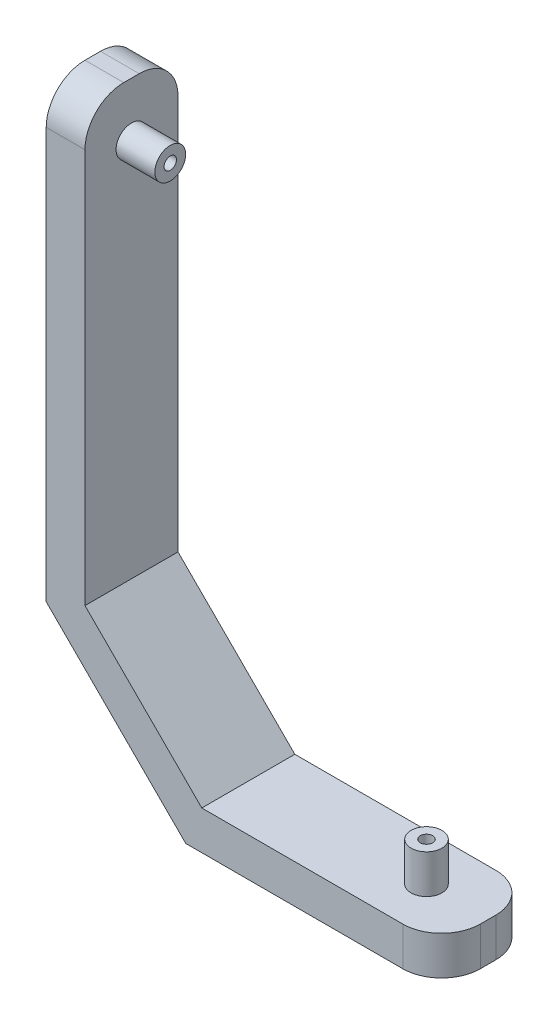
ISO-10303-21;
HEADER;
FILE_DESCRIPTION(('STEP AP214'),'2;1');
FILE_NAME('part.step','',(''),(''),'','','');
FILE_SCHEMA(('AUTOMOTIVE_DESIGN { 1 0 10303 214 1 1 1 1 }'));
ENDSEC;
DATA;
#1=APPLICATION_CONTEXT('core data for automotive mechanical design processes');
#2=APPLICATION_PROTOCOL_DEFINITION('international standard','automotive_design',2000,#1);
#3=PRODUCT_CONTEXT('',#1,'mechanical');
#4=PRODUCT('Part','Part','',(#3));
#5=PRODUCT_RELATED_PRODUCT_CATEGORY('part','',(#4));
#6=PRODUCT_DEFINITION_FORMATION('','',#4);
#7=PRODUCT_DEFINITION_CONTEXT('part definition',#1,'design');
#8=PRODUCT_DEFINITION('design','',#6,#7);
#9=PRODUCT_DEFINITION_SHAPE('','',#8);
#10=(LENGTH_UNIT() NAMED_UNIT(*) SI_UNIT(.MILLI.,.METRE.));
#11=(NAMED_UNIT(*) PLANE_ANGLE_UNIT() SI_UNIT($,.RADIAN.));
#12=(NAMED_UNIT(*) SI_UNIT($,.STERADIAN.) SOLID_ANGLE_UNIT());
#13=UNCERTAINTY_MEASURE_WITH_UNIT(LENGTH_MEASURE(1.E-05),#10,'distance_accuracy_value','');
#14=(GEOMETRIC_REPRESENTATION_CONTEXT(3) GLOBAL_UNCERTAINTY_ASSIGNED_CONTEXT((#13)) GLOBAL_UNIT_ASSIGNED_CONTEXT((#10,
#11,#12)) REPRESENTATION_CONTEXT('',''));
#15=CARTESIAN_POINT('',(0.,0.,0.));
#16=DIRECTION('',(0.,0.,1.));
#17=DIRECTION('',(1.,0.,0.));
#18=AXIS2_PLACEMENT_3D('',#15,#16,#17);
#19=CARTESIAN_POINT('',(-86.2,128.,0.));
#20=DIRECTION('',(1.,0.,0.));
#21=DIRECTION('',(0.,0.,-1.));
#22=AXIS2_PLACEMENT_3D('',#19,#20,#21);
#23=CYLINDRICAL_SURFACE('',#22,1.6);
#24=CARTESIAN_POINT('',(-66.2,128.,0.));
#25=DIRECTION('',(1.,0.,0.));
#26=DIRECTION('',(0.,0.,-1.));
#27=AXIS2_PLACEMENT_3D('',#24,#25,#26);
#28=CIRCLE('',#27,1.6);
#29=CARTESIAN_POINT('',(-66.2,128.,-1.6));
#30=VERTEX_POINT('',#29);
#31=EDGE_CURVE('E315',#30,#30,#28,.T.);
#32=ORIENTED_EDGE('',*,*,#31,.T.);
#33=EDGE_LOOP('',(#32));
#34=FACE_BOUND('',#33,.T.);
#35=CARTESIAN_POINT('',(-83.2,128.,0.));
#36=DIRECTION('',(-1.,0.,0.));
#37=DIRECTION('',(0.,0.,1.));
#38=AXIS2_PLACEMENT_3D('',#35,#36,#37);
#39=CIRCLE('',#38,1.6);
#40=CARTESIAN_POINT('',(-83.2,128.,1.6));
#41=VERTEX_POINT('',#40);
#42=EDGE_CURVE('E112',#41,#41,#39,.F.);
#43=ORIENTED_EDGE('',*,*,#42,.F.);
#44=EDGE_LOOP('',(#43));
#45=FACE_BOUND('',#44,.T.);
#46=ADVANCED_FACE('F108',(#34,#45),#23,.F.);
#47=CARTESIAN_POINT('',(0.,0.,-12.));
#48=DIRECTION('',(0.,0.,1.));
#49=DIRECTION('',(1.,0.,0.));
#50=AXIS2_PLACEMENT_3D('',#47,#48,#49);
#51=PLANE('',#50);
#52=DIRECTION('',(0.,-1.,0.));
#53=VECTOR('',#52,1.);
#54=CARTESIAN_POINT('',(-86.2,0.,-12.));
#55=LINE('',#54,#53);
#56=CARTESIAN_POINT('',(-86.2,132.,-12.));
#57=VERTEX_POINT('',#56);
#58=CARTESIAN_POINT('',(-86.2,26.0000000000001,-12.));
#59=VERTEX_POINT('',#58);
#60=EDGE_CURVE('E237',#57,#59,#55,.T.);
#61=ORIENTED_EDGE('',*,*,#60,.F.);
#62=DIRECTION('',(-1.,0.,0.));
#63=VECTOR('',#62,1.);
#64=CARTESIAN_POINT('',(0.,132.,-12.));
#65=LINE('',#64,#63);
#66=CARTESIAN_POINT('',(-76.2,132.,-12.));
#67=VERTEX_POINT('',#66);
#68=EDGE_CURVE('E269',#57,#67,#65,.F.);
#69=ORIENTED_EDGE('',*,*,#68,.T.);
#70=DIRECTION('',(0.,-1.,0.));
#71=VECTOR('',#70,1.);
#72=CARTESIAN_POINT('',(-76.2,0.,-12.));
#73=LINE('',#72,#71);
#74=CARTESIAN_POINT('',(-76.2,30.142135623731,-12.));
#75=VERTEX_POINT('',#74);
#76=EDGE_CURVE('E230',#67,#75,#73,.T.);
#77=ORIENTED_EDGE('',*,*,#76,.T.);
#78=DIRECTION('',(0.707106781186547,-0.707106781186548,0.));
#79=VECTOR('',#78,1.);
#80=CARTESIAN_POINT('',(-23.0289321881346,-23.0289321881345,-12.));
#81=LINE('',#80,#79);
#82=CARTESIAN_POINT('',(-46.057864376269,0.,-12.));
#83=VERTEX_POINT('',#82);
#84=EDGE_CURVE('E226',#75,#83,#81,.T.);
#85=ORIENTED_EDGE('',*,*,#84,.T.);
#86=DIRECTION('',(-1.,0.,0.));
#87=VECTOR('',#86,1.);
#88=CARTESIAN_POINT('',(15.8,0.,-12.));
#89=LINE('',#88,#87);
#90=CARTESIAN_POINT('',(5.8,0.,-12.));
#91=VERTEX_POINT('',#90);
#92=EDGE_CURVE('E209',#91,#83,#89,.T.);
#93=ORIENTED_EDGE('',*,*,#92,.F.);
#94=DIRECTION('',(0.,-1.,0.));
#95=VECTOR('',#94,1.);
#96=CARTESIAN_POINT('',(5.8,0.,-12.));
#97=LINE('',#96,#95);
#98=CARTESIAN_POINT('',(5.8,-10.,-12.));
#99=VERTEX_POINT('',#98);
#100=EDGE_CURVE('E207',#91,#99,#97,.T.);
#101=ORIENTED_EDGE('',*,*,#100,.T.);
#102=DIRECTION('',(-1.,0.,0.));
#103=VECTOR('',#102,1.);
#104=CARTESIAN_POINT('',(15.8,-10.,-12.));
#105=LINE('',#104,#103);
#106=CARTESIAN_POINT('',(-50.2,-10.,-12.));
#107=VERTEX_POINT('',#106);
#108=EDGE_CURVE('E199',#99,#107,#105,.T.);
#109=ORIENTED_EDGE('',*,*,#108,.T.);
#110=DIRECTION('',(-0.707106781186546,0.707106781186549,0.));
#111=VECTOR('',#110,1.);
#112=CARTESIAN_POINT('',(-30.1000000000001,-30.1,-12.));
#113=LINE('',#112,#111);
#114=EDGE_CURVE('E204',#107,#59,#113,.T.);
#115=ORIENTED_EDGE('',*,*,#114,.T.);
#116=EDGE_LOOP('',(#61,#69,#77,#85,#93,#101,#109,#115));
#117=FACE_BOUND('',#116,.T.);
#118=ADVANCED_FACE('F202',(#117),#51,.F.);
#119=CARTESIAN_POINT('',(15.8,0.,-12.));
#120=DIRECTION('',(0.,1.,0.));
#121=DIRECTION('',(-1.,0.,0.));
#122=AXIS2_PLACEMENT_3D('',#119,#120,#121);
#123=PLANE('',#122);
#124=CARTESIAN_POINT('',(-0.0882280599999965,0.,0.));
#125=DIRECTION('',(0.,1.,0.));
#126=DIRECTION('',(0.,0.,1.));
#127=AXIS2_PLACEMENT_3D('',#124,#125,#126);
#128=CIRCLE('',#127,3.98);
#129=CARTESIAN_POINT('',(-0.0882280599999965,0.,3.98));
#130=VERTEX_POINT('',#129);
#131=EDGE_CURVE('E327',#130,#130,#128,.T.);
#132=ORIENTED_EDGE('',*,*,#131,.F.);
#133=EDGE_LOOP('',(#132));
#134=FACE_BOUND('',#133,.T.);
#135=DIRECTION('',(0.,0.,1.));
#136=VECTOR('',#135,1.);
#137=CARTESIAN_POINT('',(15.8,0.,-12.));
#138=LINE('',#137,#136);
#139=CARTESIAN_POINT('',(15.8,0.,-2.));
#140=VERTEX_POINT('',#139);
#141=CARTESIAN_POINT('',(15.8,0.,2.));
#142=VERTEX_POINT('',#141);
#143=EDGE_CURVE('E227',#140,#142,#138,.T.);
#144=ORIENTED_EDGE('',*,*,#143,.F.);
#145=CARTESIAN_POINT('',(5.8,0.,-2.));
#146=DIRECTION('',(0.,1.,0.));
#147=DIRECTION('',(-1.,0.,0.));
#148=AXIS2_PLACEMENT_3D('',#145,#146,#147);
#149=CIRCLE('',#148,10.);
#150=EDGE_CURVE('E285',#140,#91,#149,.T.);
#151=ORIENTED_EDGE('',*,*,#150,.T.);
#152=ORIENTED_EDGE('',*,*,#92,.T.);
#153=DIRECTION('',(0.,0.,-1.));
#154=VECTOR('',#153,1.);
#155=CARTESIAN_POINT('',(-46.057864376269,0.,12.));
#156=LINE('',#155,#154);
#157=CARTESIAN_POINT('',(-46.057864376269,0.,12.));
#158=VERTEX_POINT('',#157);
#159=EDGE_CURVE('E220',#158,#83,#156,.T.);
#160=ORIENTED_EDGE('',*,*,#159,.F.);
#161=DIRECTION('',(-1.,0.,0.));
#162=VECTOR('',#161,1.);
#163=CARTESIAN_POINT('',(15.8,0.,12.));
#164=LINE('',#163,#162);
#165=CARTESIAN_POINT('',(5.8,0.,12.));
#166=VERTEX_POINT('',#165);
#167=EDGE_CURVE('E210',#166,#158,#164,.T.);
#168=ORIENTED_EDGE('',*,*,#167,.F.);
#169=CARTESIAN_POINT('',(5.8,0.,2.));
#170=DIRECTION('',(0.,1.,0.));
#171=DIRECTION('',(-1.,0.,0.));
#172=AXIS2_PLACEMENT_3D('',#169,#170,#171);
#173=CIRCLE('',#172,10.);
#174=EDGE_CURVE('E129',#166,#142,#173,.T.);
#175=ORIENTED_EDGE('',*,*,#174,.T.);
#176=EDGE_LOOP('',(#144,#151,#152,#160,#168,#175));
#177=FACE_BOUND('',#176,.T.);
#178=ADVANCED_FACE('F364',(#134,#177),#123,.T.);
#179=CARTESIAN_POINT('',(15.8,0.,-12.));
#180=DIRECTION('',(-1.,0.,0.));
#181=DIRECTION('',(0.,0.,1.));
#182=AXIS2_PLACEMENT_3D('',#179,#180,#181);
#183=PLANE('',#182);
#184=DIRECTION('',(0.,0.,1.));
#185=VECTOR('',#184,1.);
#186=CARTESIAN_POINT('',(15.8,-10.,-12.));
#187=LINE('',#186,#185);
#188=CARTESIAN_POINT('',(15.8,-10.,-2.));
#189=VERTEX_POINT('',#188);
#190=CARTESIAN_POINT('',(15.8,-10.,2.));
#191=VERTEX_POINT('',#190);
#192=EDGE_CURVE('E232',#189,#191,#187,.T.);
#193=ORIENTED_EDGE('',*,*,#192,.F.);
#194=DIRECTION('',(0.,-1.,0.));
#195=VECTOR('',#194,1.);
#196=CARTESIAN_POINT('',(15.8,0.,-2.));
#197=LINE('',#196,#195);
#198=EDGE_CURVE('E282',#189,#140,#197,.F.);
#199=ORIENTED_EDGE('',*,*,#198,.T.);
#200=ORIENTED_EDGE('',*,*,#143,.T.);
#201=DIRECTION('',(0.,-1.,0.));
#202=VECTOR('',#201,1.);
#203=CARTESIAN_POINT('',(15.8,-10.,2.));
#204=LINE('',#203,#202);
#205=EDGE_CURVE('E279',#142,#191,#204,.T.);
#206=ORIENTED_EDGE('',*,*,#205,.T.);
#207=EDGE_LOOP('',(#193,#199,#200,#206));
#208=FACE_BOUND('',#207,.T.);
#209=ADVANCED_FACE('F306',(#208),#183,.F.);
#210=CARTESIAN_POINT('',(15.8,-10.,-12.));
#211=DIRECTION('',(0.,1.,0.));
#212=DIRECTION('',(-1.,0.,0.));
#213=AXIS2_PLACEMENT_3D('',#210,#211,#212);
#214=PLANE('',#213);
#215=CARTESIAN_POINT('',(-0.0882280599999965,-10.,0.));
#216=DIRECTION('',(0.,-1.,0.));
#217=DIRECTION('',(0.,0.,-1.));
#218=AXIS2_PLACEMENT_3D('',#215,#216,#217);
#219=CIRCLE('',#218,4.);
#220=CARTESIAN_POINT('',(-0.0882280599999965,-10.,-4.));
#221=VERTEX_POINT('',#220);
#222=EDGE_CURVE('E339',#221,#221,#219,.T.);
#223=ORIENTED_EDGE('',*,*,#222,.F.);
#224=EDGE_LOOP('',(#223));
#225=FACE_BOUND('',#224,.T.);
#226=ORIENTED_EDGE('',*,*,#108,.F.);
#227=CARTESIAN_POINT('',(5.8,-10.,-2.));
#228=DIRECTION('',(0.,1.,0.));
#229=DIRECTION('',(-1.,0.,0.));
#230=AXIS2_PLACEMENT_3D('',#227,#228,#229);
#231=CIRCLE('',#230,10.);
#232=EDGE_CURVE('E277',#99,#189,#231,.F.);
#233=ORIENTED_EDGE('',*,*,#232,.T.);
#234=ORIENTED_EDGE('',*,*,#192,.T.);
#235=CARTESIAN_POINT('',(5.8,-10.,2.));
#236=DIRECTION('',(0.,1.,0.));
#237=DIRECTION('',(-1.,0.,0.));
#238=AXIS2_PLACEMENT_3D('',#235,#236,#237);
#239=CIRCLE('',#238,10.);
#240=CARTESIAN_POINT('',(5.8,-10.,12.));
#241=VERTEX_POINT('',#240);
#242=EDGE_CURVE('E275',#191,#241,#239,.F.);
#243=ORIENTED_EDGE('',*,*,#242,.T.);
#244=DIRECTION('',(-1.,0.,0.));
#245=VECTOR('',#244,1.);
#246=CARTESIAN_POINT('',(15.8,-10.,12.));
#247=LINE('',#246,#245);
#248=CARTESIAN_POINT('',(-50.2,-10.,12.));
#249=VERTEX_POINT('',#248);
#250=EDGE_CURVE('E215',#241,#249,#247,.T.);
#251=ORIENTED_EDGE('',*,*,#250,.T.);
#252=DIRECTION('',(0.,0.,-1.));
#253=VECTOR('',#252,1.);
#254=CARTESIAN_POINT('',(-50.2,-10.,12.));
#255=LINE('',#254,#253);
#256=EDGE_CURVE('E213',#249,#107,#255,.T.);
#257=ORIENTED_EDGE('',*,*,#256,.T.);
#258=EDGE_LOOP('',(#226,#233,#234,#243,#251,#257));
#259=FACE_BOUND('',#258,.T.);
#260=ADVANCED_FACE('F214',(#225,#259),#214,.F.);
#261=CARTESIAN_POINT('',(-30.1000000000001,-30.1,12.));
#262=DIRECTION('',(-0.707106781186548,-0.707106781186546,0.));
#263=DIRECTION('',(0.707106781186546,-0.707106781186549,0.));
#264=AXIS2_PLACEMENT_3D('',#261,#262,#263);
#265=PLANE('',#264);
#266=DIRECTION('',(0.,0.,-1.));
#267=VECTOR('',#266,1.);
#268=CARTESIAN_POINT('',(-86.2,26.0000000000001,12.));
#269=LINE('',#268,#267);
#270=CARTESIAN_POINT('',(-86.2,26.0000000000001,12.));
#271=VERTEX_POINT('',#270);
#272=EDGE_CURVE('E225',#271,#59,#269,.T.);
#273=ORIENTED_EDGE('',*,*,#272,.T.);
#274=ORIENTED_EDGE('',*,*,#114,.F.);
#275=ORIENTED_EDGE('',*,*,#256,.F.);
#276=DIRECTION('',(-0.707106781186546,0.707106781186549,0.));
#277=VECTOR('',#276,1.);
#278=CARTESIAN_POINT('',(-30.1000000000001,-30.1,12.));
#279=LINE('',#278,#277);
#280=EDGE_CURVE('E239',#249,#271,#279,.T.);
#281=ORIENTED_EDGE('',*,*,#280,.T.);
#282=EDGE_LOOP('',(#273,#274,#275,#281));
#283=FACE_BOUND('',#282,.T.);
#284=ADVANCED_FACE('F223',(#283),#265,.T.);
#285=CARTESIAN_POINT('',(-23.0289321881346,-23.0289321881345,12.));
#286=DIRECTION('',(0.707106781186548,0.707106781186547,0.));
#287=DIRECTION('',(-0.707106781186547,0.707106781186548,0.));
#288=AXIS2_PLACEMENT_3D('',#285,#286,#287);
#289=PLANE('',#288);
#290=ORIENTED_EDGE('',*,*,#159,.T.);
#291=ORIENTED_EDGE('',*,*,#84,.F.);
#292=DIRECTION('',(0.,0.,-1.));
#293=VECTOR('',#292,1.);
#294=CARTESIAN_POINT('',(-76.2,30.142135623731,12.));
#295=LINE('',#294,#293);
#296=CARTESIAN_POINT('',(-76.2,30.142135623731,12.));
#297=VERTEX_POINT('',#296);
#298=EDGE_CURVE('E255',#297,#75,#295,.T.);
#299=ORIENTED_EDGE('',*,*,#298,.F.);
#300=DIRECTION('',(0.707106781186547,-0.707106781186548,0.));
#301=VECTOR('',#300,1.);
#302=CARTESIAN_POINT('',(-23.0289321881346,-23.0289321881345,12.));
#303=LINE('',#302,#301);
#304=EDGE_CURVE('E241',#297,#158,#303,.T.);
#305=ORIENTED_EDGE('',*,*,#304,.T.);
#306=EDGE_LOOP('',(#290,#291,#299,#305));
#307=FACE_BOUND('',#306,.T.);
#308=ADVANCED_FACE('F361',(#307),#289,.T.);
#309=CARTESIAN_POINT('',(-76.2,0.,12.));
#310=DIRECTION('',(1.,0.,0.));
#311=DIRECTION('',(0.,1.,0.));
#312=AXIS2_PLACEMENT_3D('',#309,#310,#311);
#313=PLANE('',#312);
#314=CARTESIAN_POINT('',(-76.2,128.,0.));
#315=DIRECTION('',(1.,0.,0.));
#316=DIRECTION('',(0.,0.,-1.));
#317=AXIS2_PLACEMENT_3D('',#314,#315,#316);
#318=CIRCLE('',#317,3.98);
#319=CARTESIAN_POINT('',(-76.2,128.,-3.98));
#320=VERTEX_POINT('',#319);
#321=EDGE_CURVE('E312',#320,#320,#318,.T.);
#322=ORIENTED_EDGE('',*,*,#321,.F.);
#323=EDGE_LOOP('',(#322));
#324=FACE_BOUND('',#323,.T.);
#325=ORIENTED_EDGE('',*,*,#76,.F.);
#326=CARTESIAN_POINT('',(-76.2,132.,-2.));
#327=DIRECTION('',(1.,0.,0.));
#328=DIRECTION('',(0.,1.,0.));
#329=AXIS2_PLACEMENT_3D('',#326,#327,#328);
#330=CIRCLE('',#329,10.);
#331=CARTESIAN_POINT('',(-76.2,142.,-2.));
#332=VERTEX_POINT('',#331);
#333=EDGE_CURVE('E273',#67,#332,#330,.T.);
#334=ORIENTED_EDGE('',*,*,#333,.T.);
#335=DIRECTION('',(0.,0.,-1.));
#336=VECTOR('',#335,1.);
#337=CARTESIAN_POINT('',(-76.2,142.,12.));
#338=LINE('',#337,#336);
#339=CARTESIAN_POINT('',(-76.2,142.,2.));
#340=VERTEX_POINT('',#339);
#341=EDGE_CURVE('E252',#340,#332,#338,.T.);
#342=ORIENTED_EDGE('',*,*,#341,.F.);
#343=CARTESIAN_POINT('',(-76.2,132.,2.));
#344=DIRECTION('',(1.,0.,0.));
#345=DIRECTION('',(0.,1.,0.));
#346=AXIS2_PLACEMENT_3D('',#343,#344,#345);
#347=CIRCLE('',#346,10.);
#348=CARTESIAN_POINT('',(-76.2,132.,12.));
#349=VERTEX_POINT('',#348);
#350=EDGE_CURVE('E271',#340,#349,#347,.T.);
#351=ORIENTED_EDGE('',*,*,#350,.T.);
#352=DIRECTION('',(0.,-1.,0.));
#353=VECTOR('',#352,1.);
#354=CARTESIAN_POINT('',(-76.2,0.,12.));
#355=LINE('',#354,#353);
#356=EDGE_CURVE('E244',#349,#297,#355,.T.);
#357=ORIENTED_EDGE('',*,*,#356,.T.);
#358=ORIENTED_EDGE('',*,*,#298,.T.);
#359=EDGE_LOOP('',(#325,#334,#342,#351,#357,#358));
#360=FACE_BOUND('',#359,.T.);
#361=ADVANCED_FACE('F410',(#324,#360),#313,.T.);
#362=CARTESIAN_POINT('',(0.,142.,12.));
#363=DIRECTION('',(0.,-1.,0.));
#364=DIRECTION('',(0.,0.,-1.));
#365=AXIS2_PLACEMENT_3D('',#362,#363,#364);
#366=PLANE('',#365);
#367=ORIENTED_EDGE('',*,*,#341,.T.);
#368=DIRECTION('',(-1.,0.,0.));
#369=VECTOR('',#368,1.);
#370=CARTESIAN_POINT('',(0.,142.,-2.));
#371=LINE('',#370,#369);
#372=CARTESIAN_POINT('',(-86.2,142.,-2.));
#373=VERTEX_POINT('',#372);
#374=EDGE_CURVE('E261',#332,#373,#371,.T.);
#375=ORIENTED_EDGE('',*,*,#374,.T.);
#376=DIRECTION('',(0.,0.,-1.));
#377=VECTOR('',#376,1.);
#378=CARTESIAN_POINT('',(-86.2,142.,12.));
#379=LINE('',#378,#377);
#380=CARTESIAN_POINT('',(-86.2,142.,2.));
#381=VERTEX_POINT('',#380);
#382=EDGE_CURVE('E249',#381,#373,#379,.T.);
#383=ORIENTED_EDGE('',*,*,#382,.F.);
#384=DIRECTION('',(-1.,0.,0.));
#385=VECTOR('',#384,1.);
#386=CARTESIAN_POINT('',(-76.2,142.,2.));
#387=LINE('',#386,#385);
#388=EDGE_CURVE('E219',#381,#340,#387,.F.);
#389=ORIENTED_EDGE('',*,*,#388,.T.);
#390=EDGE_LOOP('',(#367,#375,#383,#389));
#391=FACE_BOUND('',#390,.T.);
#392=ADVANCED_FACE('F414',(#391),#366,.F.);
#393=CARTESIAN_POINT('',(-86.2,0.,12.));
#394=DIRECTION('',(1.,0.,0.));
#395=DIRECTION('',(0.,1.,0.));
#396=AXIS2_PLACEMENT_3D('',#393,#394,#395);
#397=PLANE('',#396);
#398=CARTESIAN_POINT('',(-86.2,128.,0.));
#399=DIRECTION('',(-1.,0.,0.));
#400=DIRECTION('',(0.,0.,1.));
#401=AXIS2_PLACEMENT_3D('',#398,#399,#400);
#402=CIRCLE('',#401,2.);
#403=CARTESIAN_POINT('',(-86.2,128.,2.));
#404=VERTEX_POINT('',#403);
#405=EDGE_CURVE('E320',#404,#404,#402,.T.);
#406=ORIENTED_EDGE('',*,*,#405,.F.);
#407=EDGE_LOOP('',(#406));
#408=FACE_BOUND('',#407,.T.);
#409=ORIENTED_EDGE('',*,*,#382,.T.);
#410=CARTESIAN_POINT('',(-86.2,132.,-2.));
#411=DIRECTION('',(1.,0.,0.));
#412=DIRECTION('',(0.,1.,0.));
#413=AXIS2_PLACEMENT_3D('',#410,#411,#412);
#414=CIRCLE('',#413,10.);
#415=EDGE_CURVE('E266',#373,#57,#414,.F.);
#416=ORIENTED_EDGE('',*,*,#415,.T.);
#417=ORIENTED_EDGE('',*,*,#60,.T.);
#418=ORIENTED_EDGE('',*,*,#272,.F.);
#419=DIRECTION('',(0.,-1.,0.));
#420=VECTOR('',#419,1.);
#421=CARTESIAN_POINT('',(-86.2,0.,12.));
#422=LINE('',#421,#420);
#423=CARTESIAN_POINT('',(-86.2,132.,12.));
#424=VERTEX_POINT('',#423);
#425=EDGE_CURVE('E246',#424,#271,#422,.T.);
#426=ORIENTED_EDGE('',*,*,#425,.F.);
#427=CARTESIAN_POINT('',(-86.2,132.,2.));
#428=DIRECTION('',(1.,0.,0.));
#429=DIRECTION('',(0.,1.,0.));
#430=AXIS2_PLACEMENT_3D('',#427,#428,#429);
#431=CIRCLE('',#430,10.);
#432=EDGE_CURVE('E264',#424,#381,#431,.F.);
#433=ORIENTED_EDGE('',*,*,#432,.T.);
#434=EDGE_LOOP('',(#409,#416,#417,#418,#426,#433));
#435=FACE_BOUND('',#434,.T.);
#436=ADVANCED_FACE('F296',(#408,#435),#397,.F.);
#437=CARTESIAN_POINT('',(0.,0.,12.));
#438=DIRECTION('',(0.,0.,1.));
#439=DIRECTION('',(1.,0.,0.));
#440=AXIS2_PLACEMENT_3D('',#437,#438,#439);
#441=PLANE('',#440);
#442=ORIENTED_EDGE('',*,*,#250,.F.);
#443=DIRECTION('',(0.,-1.,0.));
#444=VECTOR('',#443,1.);
#445=CARTESIAN_POINT('',(5.8,0.,12.));
#446=LINE('',#445,#444);
#447=EDGE_CURVE('E12',#241,#166,#446,.F.);
#448=ORIENTED_EDGE('',*,*,#447,.T.);
#449=ORIENTED_EDGE('',*,*,#167,.T.);
#450=ORIENTED_EDGE('',*,*,#304,.F.);
#451=ORIENTED_EDGE('',*,*,#356,.F.);
#452=DIRECTION('',(-1.,0.,0.));
#453=VECTOR('',#452,1.);
#454=CARTESIAN_POINT('',(-86.2,132.,12.));
#455=LINE('',#454,#453);
#456=EDGE_CURVE('E117',#349,#424,#455,.T.);
#457=ORIENTED_EDGE('',*,*,#456,.T.);
#458=ORIENTED_EDGE('',*,*,#425,.T.);
#459=ORIENTED_EDGE('',*,*,#280,.F.);
#460=EDGE_LOOP('',(#442,#448,#449,#450,#451,#457,#458,#459));
#461=FACE_BOUND('',#460,.T.);
#462=ADVANCED_FACE('F291',(#461),#441,.T.);
#463=CARTESIAN_POINT('',(0.,132.,-2.));
#464=DIRECTION('',(-1.,0.,0.));
#465=DIRECTION('',(0.,0.,1.));
#466=AXIS2_PLACEMENT_3D('',#463,#464,#465);
#467=CYLINDRICAL_SURFACE('',#466,10.);
#468=ORIENTED_EDGE('',*,*,#333,.F.);
#469=ORIENTED_EDGE('',*,*,#68,.F.);
#470=ORIENTED_EDGE('',*,*,#415,.F.);
#471=ORIENTED_EDGE('',*,*,#374,.F.);
#472=EDGE_LOOP('',(#468,#469,#470,#471));
#473=FACE_BOUND('',#472,.T.);
#474=ADVANCED_FACE('F399',(#473),#467,.T.);
#475=CARTESIAN_POINT('',(5.8,0.,-2.));
#476=DIRECTION('',(0.,-1.,0.));
#477=DIRECTION('',(0.,0.,-1.));
#478=AXIS2_PLACEMENT_3D('',#475,#476,#477);
#479=CYLINDRICAL_SURFACE('',#478,10.);
#480=ORIENTED_EDGE('',*,*,#150,.F.);
#481=ORIENTED_EDGE('',*,*,#198,.F.);
#482=ORIENTED_EDGE('',*,*,#232,.F.);
#483=ORIENTED_EDGE('',*,*,#100,.F.);
#484=EDGE_LOOP('',(#480,#481,#482,#483));
#485=FACE_BOUND('',#484,.T.);
#486=ADVANCED_FACE('F397',(#485),#479,.T.);
#487=CARTESIAN_POINT('',(5.8,0.,2.));
#488=DIRECTION('',(0.,1.,0.));
#489=DIRECTION('',(0.,0.,1.));
#490=AXIS2_PLACEMENT_3D('',#487,#488,#489);
#491=CYLINDRICAL_SURFACE('',#490,10.);
#492=ORIENTED_EDGE('',*,*,#174,.F.);
#493=ORIENTED_EDGE('',*,*,#447,.F.);
#494=ORIENTED_EDGE('',*,*,#242,.F.);
#495=ORIENTED_EDGE('',*,*,#205,.F.);
#496=EDGE_LOOP('',(#492,#493,#494,#495));
#497=FACE_BOUND('',#496,.T.);
#498=ADVANCED_FACE('F301',(#497),#491,.T.);
#499=CARTESIAN_POINT('',(0.,132.,2.));
#500=DIRECTION('',(1.,0.,0.));
#501=DIRECTION('',(0.,0.,-1.));
#502=AXIS2_PLACEMENT_3D('',#499,#500,#501);
#503=CYLINDRICAL_SURFACE('',#502,10.);
#504=ORIENTED_EDGE('',*,*,#350,.F.);
#505=ORIENTED_EDGE('',*,*,#388,.F.);
#506=ORIENTED_EDGE('',*,*,#432,.F.);
#507=ORIENTED_EDGE('',*,*,#456,.F.);
#508=EDGE_LOOP('',(#504,#505,#506,#507));
#509=FACE_BOUND('',#508,.T.);
#510=ADVANCED_FACE('F110',(#509),#503,.T.);
#511=CARTESIAN_POINT('',(-66.2,128.,0.));
#512=DIRECTION('',(-1.,0.,0.));
#513=DIRECTION('',(0.,0.,1.));
#514=AXIS2_PLACEMENT_3D('',#511,#512,#513);
#515=CYLINDRICAL_SURFACE('',#514,3.98);
#516=CARTESIAN_POINT('',(-66.2,128.,0.));
#517=DIRECTION('',(1.,0.,0.));
#518=DIRECTION('',(0.,0.,-1.));
#519=AXIS2_PLACEMENT_3D('',#516,#517,#518);
#520=CIRCLE('',#519,3.98);
#521=CARTESIAN_POINT('',(-66.2,128.,-3.98));
#522=VERTEX_POINT('',#521);
#523=EDGE_CURVE('E298',#522,#522,#520,.T.);
#524=ORIENTED_EDGE('',*,*,#523,.F.);
#525=EDGE_LOOP('',(#524));
#526=FACE_BOUND('',#525,.T.);
#527=ORIENTED_EDGE('',*,*,#321,.T.);
#528=EDGE_LOOP('',(#527));
#529=FACE_BOUND('',#528,.T.);
#530=ADVANCED_FACE('F383',(#526,#529),#515,.T.);
#531=CARTESIAN_POINT('',(-66.2,128.,0.));
#532=DIRECTION('',(1.,0.,0.));
#533=DIRECTION('',(0.,0.,-1.));
#534=AXIS2_PLACEMENT_3D('',#531,#532,#533);
#535=PLANE('',#534);
#536=ORIENTED_EDGE('',*,*,#31,.F.);
#537=EDGE_LOOP('',(#536));
#538=FACE_BOUND('',#537,.T.);
#539=ORIENTED_EDGE('',*,*,#523,.T.);
#540=EDGE_LOOP('',(#539));
#541=FACE_BOUND('',#540,.T.);
#542=ADVANCED_FACE('F380',(#538,#541),#535,.T.);
#543=CARTESIAN_POINT('',(-83.2,128.,0.));
#544=DIRECTION('',(-1.,0.,0.));
#545=DIRECTION('',(0.,0.,1.));
#546=AXIS2_PLACEMENT_3D('',#543,#544,#545);
#547=PLANE('',#546);
#548=CARTESIAN_POINT('',(-83.2,128.,0.));
#549=DIRECTION('',(-1.,0.,0.));
#550=DIRECTION('',(0.,0.,1.));
#551=AXIS2_PLACEMENT_3D('',#548,#549,#550);
#552=CIRCLE('',#551,2.);
#553=CARTESIAN_POINT('',(-83.2,128.,2.));
#554=VERTEX_POINT('',#553);
#555=EDGE_CURVE('E323',#554,#554,#552,.T.);
#556=ORIENTED_EDGE('',*,*,#555,.T.);
#557=EDGE_LOOP('',(#556));
#558=FACE_BOUND('',#557,.T.);
#559=ORIENTED_EDGE('',*,*,#42,.T.);
#560=EDGE_LOOP('',(#559));
#561=FACE_BOUND('',#560,.T.);
#562=ADVANCED_FACE('F382',(#558,#561),#547,.T.);
#563=CARTESIAN_POINT('',(-83.2,128.,0.));
#564=DIRECTION('',(-1.,0.,0.));
#565=DIRECTION('',(0.,0.,1.));
#566=AXIS2_PLACEMENT_3D('',#563,#564,#565);
#567=CYLINDRICAL_SURFACE('',#566,2.);
#568=ORIENTED_EDGE('',*,*,#555,.F.);
#569=EDGE_LOOP('',(#568));
#570=FACE_BOUND('',#569,.T.);
#571=ORIENTED_EDGE('',*,*,#405,.T.);
#572=EDGE_LOOP('',(#571));
#573=FACE_BOUND('',#572,.T.);
#574=ADVANCED_FACE('F378',(#570,#573),#567,.F.);
#575=CARTESIAN_POINT('',(-0.0882280599999965,10.,0.));
#576=DIRECTION('',(0.,-1.,0.));
#577=DIRECTION('',(0.,0.,-1.));
#578=AXIS2_PLACEMENT_3D('',#575,#576,#577);
#579=CYLINDRICAL_SURFACE('',#578,3.98);
#580=CARTESIAN_POINT('',(-0.0882280599999965,10.,0.));
#581=DIRECTION('',(0.,1.,0.));
#582=DIRECTION('',(0.,0.,1.));
#583=AXIS2_PLACEMENT_3D('',#580,#581,#582);
#584=CIRCLE('',#583,3.98);
#585=CARTESIAN_POINT('',(-0.0882280599999965,10.,3.98));
#586=VERTEX_POINT('',#585);
#587=EDGE_CURVE('E324',#586,#586,#584,.T.);
#588=ORIENTED_EDGE('',*,*,#587,.F.);
#589=EDGE_LOOP('',(#588));
#590=FACE_BOUND('',#589,.T.);
#591=ORIENTED_EDGE('',*,*,#131,.T.);
#592=EDGE_LOOP('',(#591));
#593=FACE_BOUND('',#592,.T.);
#594=ADVANCED_FACE('F482',(#590,#593),#579,.T.);
#595=CARTESIAN_POINT('',(-0.0882280599999965,10.,0.));
#596=DIRECTION('',(0.,1.,0.));
#597=DIRECTION('',(0.,0.,1.));
#598=AXIS2_PLACEMENT_3D('',#595,#596,#597);
#599=PLANE('',#598);
#600=CARTESIAN_POINT('',(-0.0882280599999965,10.,0.));
#601=DIRECTION('',(0.,1.,0.));
#602=DIRECTION('',(0.,0.,1.));
#603=AXIS2_PLACEMENT_3D('',#600,#601,#602);
#604=CIRCLE('',#603,1.6);
#605=CARTESIAN_POINT('',(-0.0882280599999965,10.,1.6));
#606=VERTEX_POINT('',#605);
#607=EDGE_CURVE('E330',#606,#606,#604,.T.);
#608=ORIENTED_EDGE('',*,*,#607,.F.);
#609=EDGE_LOOP('',(#608));
#610=FACE_BOUND('',#609,.T.);
#611=ORIENTED_EDGE('',*,*,#587,.T.);
#612=EDGE_LOOP('',(#611));
#613=FACE_BOUND('',#612,.T.);
#614=ADVANCED_FACE('F490',(#610,#613),#599,.T.);
#615=CARTESIAN_POINT('',(-0.0882280599999965,-7.00000000000001,0.));
#616=DIRECTION('',(0.,1.,0.));
#617=DIRECTION('',(0.,0.,1.));
#618=AXIS2_PLACEMENT_3D('',#615,#616,#617);
#619=CYLINDRICAL_SURFACE('',#618,1.6);
#620=CARTESIAN_POINT('',(-0.0882280599999965,-7.00000000000001,0.));
#621=DIRECTION('',(0.,1.,0.));
#622=DIRECTION('',(0.,0.,1.));
#623=AXIS2_PLACEMENT_3D('',#620,#621,#622);
#624=CIRCLE('',#623,1.6);
#625=CARTESIAN_POINT('',(-0.0882280599999965,-7.00000000000001,1.6));
#626=VERTEX_POINT('',#625);
#627=EDGE_CURVE('E335',#626,#626,#624,.T.);
#628=ORIENTED_EDGE('',*,*,#627,.F.);
#629=EDGE_LOOP('',(#628));
#630=FACE_BOUND('',#629,.T.);
#631=ORIENTED_EDGE('',*,*,#607,.T.);
#632=EDGE_LOOP('',(#631));
#633=FACE_BOUND('',#632,.T.);
#634=ADVANCED_FACE('F500',(#630,#633),#619,.F.);
#635=CARTESIAN_POINT('',(-0.0882280599999965,-7.,0.));
#636=DIRECTION('',(0.,-1.,0.));
#637=DIRECTION('',(0.,0.,-1.));
#638=AXIS2_PLACEMENT_3D('',#635,#636,#637);
#639=PLANE('',#638);
#640=CARTESIAN_POINT('',(-0.0882280599999965,-7.,0.));
#641=DIRECTION('',(0.,-1.,0.));
#642=DIRECTION('',(0.,0.,-1.));
#643=AXIS2_PLACEMENT_3D('',#640,#641,#642);
#644=CIRCLE('',#643,4.);
#645=CARTESIAN_POINT('',(-0.0882280599999965,-7.,-4.));
#646=VERTEX_POINT('',#645);
#647=EDGE_CURVE('E338',#646,#646,#644,.T.);
#648=ORIENTED_EDGE('',*,*,#647,.T.);
#649=EDGE_LOOP('',(#648));
#650=FACE_BOUND('',#649,.T.);
#651=ORIENTED_EDGE('',*,*,#627,.T.);
#652=EDGE_LOOP('',(#651));
#653=FACE_BOUND('',#652,.T.);
#654=ADVANCED_FACE('F345',(#650,#653),#639,.T.);
#655=CARTESIAN_POINT('',(-0.0882280599999965,-7.,0.));
#656=DIRECTION('',(0.,-1.,0.));
#657=DIRECTION('',(0.,0.,-1.));
#658=AXIS2_PLACEMENT_3D('',#655,#656,#657);
#659=CYLINDRICAL_SURFACE('',#658,4.);
#660=CARTESIAN_POINT('',(-0.0882280599999965,-7.,-4.));
#661=CARTESIAN_POINT('',(-0.0882280599999965,-7.03125,-4.));
#662=CARTESIAN_POINT('',(-0.0882280599999965,-7.0625,-4.));
#663=CARTESIAN_POINT('',(-0.0882280599999965,-7.125,-4.));
#664=CARTESIAN_POINT('',(-0.0882280599999965,-7.15625,-4.));
#665=CARTESIAN_POINT('',(-0.0882280599999965,-7.21875,-4.));
#666=CARTESIAN_POINT('',(-0.0882280599999965,-7.25,-4.));
#667=CARTESIAN_POINT('',(-0.0882280599999965,-7.3125,-4.));
#668=CARTESIAN_POINT('',(-0.0882280599999965,-7.34375,-4.));
#669=CARTESIAN_POINT('',(-0.0882280599999965,-7.40625,-4.));
#670=CARTESIAN_POINT('',(-0.0882280599999965,-7.4375,-4.));
#671=CARTESIAN_POINT('',(-0.0882280599999965,-7.5,-4.));
#672=CARTESIAN_POINT('',(-0.0882280599999965,-7.53125,-4.));
#673=CARTESIAN_POINT('',(-0.0882280599999965,-7.59375,-4.));
#674=CARTESIAN_POINT('',(-0.0882280599999965,-7.625,-4.));
#675=CARTESIAN_POINT('',(-0.0882280599999965,-7.6875,-4.));
#676=CARTESIAN_POINT('',(-0.0882280599999965,-7.71875,-4.));
#677=CARTESIAN_POINT('',(-0.0882280599999965,-7.78125,-4.));
#678=CARTESIAN_POINT('',(-0.0882280599999965,-7.8125,-4.));
#679=CARTESIAN_POINT('',(-0.0882280599999965,-7.875,-4.));
#680=CARTESIAN_POINT('',(-0.0882280599999965,-7.90625,-4.));
#681=CARTESIAN_POINT('',(-0.0882280599999965,-7.96875,-4.));
#682=CARTESIAN_POINT('',(-0.0882280599999965,-8.,-4.));
#683=CARTESIAN_POINT('',(-0.0882280599999965,-8.0625,-4.));
#684=CARTESIAN_POINT('',(-0.0882280599999965,-8.09375,-4.));
#685=CARTESIAN_POINT('',(-0.0882280599999965,-8.15625,-4.));
#686=CARTESIAN_POINT('',(-0.0882280599999965,-8.1875,-4.));
#687=CARTESIAN_POINT('',(-0.0882280599999965,-8.25,-4.));
#688=CARTESIAN_POINT('',(-0.0882280599999965,-8.28125,-4.));
#689=CARTESIAN_POINT('',(-0.0882280599999965,-8.34375,-4.));
#690=CARTESIAN_POINT('',(-0.0882280599999965,-8.375,-4.));
#691=CARTESIAN_POINT('',(-0.0882280599999965,-8.4375,-4.));
#692=CARTESIAN_POINT('',(-0.0882280599999965,-8.46875,-4.));
#693=CARTESIAN_POINT('',(-0.0882280599999965,-8.53125,-4.));
#694=CARTESIAN_POINT('',(-0.0882280599999965,-8.5625,-4.));
#695=CARTESIAN_POINT('',(-0.0882280599999965,-8.625,-4.));
#696=CARTESIAN_POINT('',(-0.0882280599999965,-8.65625,-4.));
#697=CARTESIAN_POINT('',(-0.0882280599999965,-8.71875,-4.));
#698=CARTESIAN_POINT('',(-0.0882280599999965,-8.75,-4.));
#699=CARTESIAN_POINT('',(-0.0882280599999965,-8.8125,-4.));
#700=CARTESIAN_POINT('',(-0.0882280599999965,-8.84375,-4.));
#701=CARTESIAN_POINT('',(-0.0882280599999965,-8.90625,-4.));
#702=CARTESIAN_POINT('',(-0.0882280599999965,-8.9375,-4.));
#703=CARTESIAN_POINT('',(-0.0882280599999965,-9.,-4.));
#704=CARTESIAN_POINT('',(-0.0882280599999965,-9.03125,-4.));
#705=CARTESIAN_POINT('',(-0.0882280599999965,-9.09375,-4.));
#706=CARTESIAN_POINT('',(-0.0882280599999965,-9.125,-4.));
#707=CARTESIAN_POINT('',(-0.0882280599999965,-9.1875,-4.));
#708=CARTESIAN_POINT('',(-0.0882280599999965,-9.21875,-4.));
#709=CARTESIAN_POINT('',(-0.0882280599999965,-9.28125,-4.));
#710=CARTESIAN_POINT('',(-0.0882280599999965,-9.3125,-4.));
#711=CARTESIAN_POINT('',(-0.0882280599999965,-9.375,-4.));
#712=CARTESIAN_POINT('',(-0.0882280599999965,-9.40625,-4.));
#713=CARTESIAN_POINT('',(-0.0882280599999965,-9.46875,-4.));
#714=CARTESIAN_POINT('',(-0.0882280599999965,-9.5,-4.));
#715=CARTESIAN_POINT('',(-0.0882280599999965,-9.5625,-4.));
#716=CARTESIAN_POINT('',(-0.0882280599999965,-9.59375,-4.));
#717=CARTESIAN_POINT('',(-0.0882280599999965,-9.65625,-4.));
#718=CARTESIAN_POINT('',(-0.0882280599999965,-9.6875,-4.));
#719=CARTESIAN_POINT('',(-0.0882280599999965,-9.75,-4.));
#720=CARTESIAN_POINT('',(-0.0882280599999965,-9.78125,-4.));
#721=CARTESIAN_POINT('',(-0.0882280599999965,-9.84375,-4.));
#722=CARTESIAN_POINT('',(-0.0882280599999965,-9.875,-4.));
#723=CARTESIAN_POINT('',(-0.0882280599999965,-9.9375,-4.));
#724=CARTESIAN_POINT('',(-0.0882280599999965,-9.96875,-4.));
#725=CARTESIAN_POINT('',(-0.0882280599999965,-10.,-4.));
#726=B_SPLINE_CURVE_WITH_KNOTS('',3,(#660,#661,#662,#663,#664,#665,#666,#667,#668,#669,#670,
#671,#672,#673,#674,#675,#676,#677,#678,#679,#680,#681,#682,#683,#684,#685,#686,#687,#688,#689,
#690,#691,#692,#693,#694,#695,#696,#697,#698,#699,#700,#701,#702,#703,#704,#705,#706,#707,#708,
#709,#710,#711,#712,#713,#714,#715,#716,#717,#718,#719,#720,#721,#722,#723,#724,#725),
.UNSPECIFIED.,.F.,.F.,(4,2,2,2,2,2,2,2,2,2,2,2,2,2,2,2,2,2,2,2,2,2,2,2,2,2,2,2,2,2,2,2,4),(0.,
0.0937499999999992,0.187499999999999,0.281249999999999,0.374999999999999,0.46875,0.5625,0.65625,
0.75,0.84375,0.9375,1.03125,1.125,1.21875,1.3125,1.40625,1.5,1.59375,1.6875,1.78125,1.875,
1.96875,2.0625,2.15625,2.25,2.34375,2.4375,2.53125,2.625,2.71875,2.8125,2.90625,3.),.UNSPECIFIED.);
#727=EDGE_CURVE('BSEAM348',#646,#221,#726,.T.);
#728=ORIENTED_EDGE('',*,*,#647,.F.);
#729=ORIENTED_EDGE('',*,*,#222,.T.);
#730=ORIENTED_EDGE('',*,*,#727,.T.);
#731=ORIENTED_EDGE('',*,*,#727,.F.);
#732=EDGE_LOOP('',(#728,#730,#729,#731));
#733=FACE_BOUND('',#732,.T.);
#734=ADVANCED_FACE('F348',(#733),#659,.F.);
#735=CLOSED_SHELL('',(#46,#118,#178,#209,#260,#284,#308,#361,#392,#436,#462,#474,#486,#498,#510,
#530,#542,#562,#574,#594,#614,#634,#654,#734));
#736=MANIFOLD_SOLID_BREP('B2',#735);
#737=ADVANCED_BREP_SHAPE_REPRESENTATION('',(#18,#736),#14);
#738=SHAPE_DEFINITION_REPRESENTATION(#9,#737);
ENDSEC;
END-ISO-10303-21;
